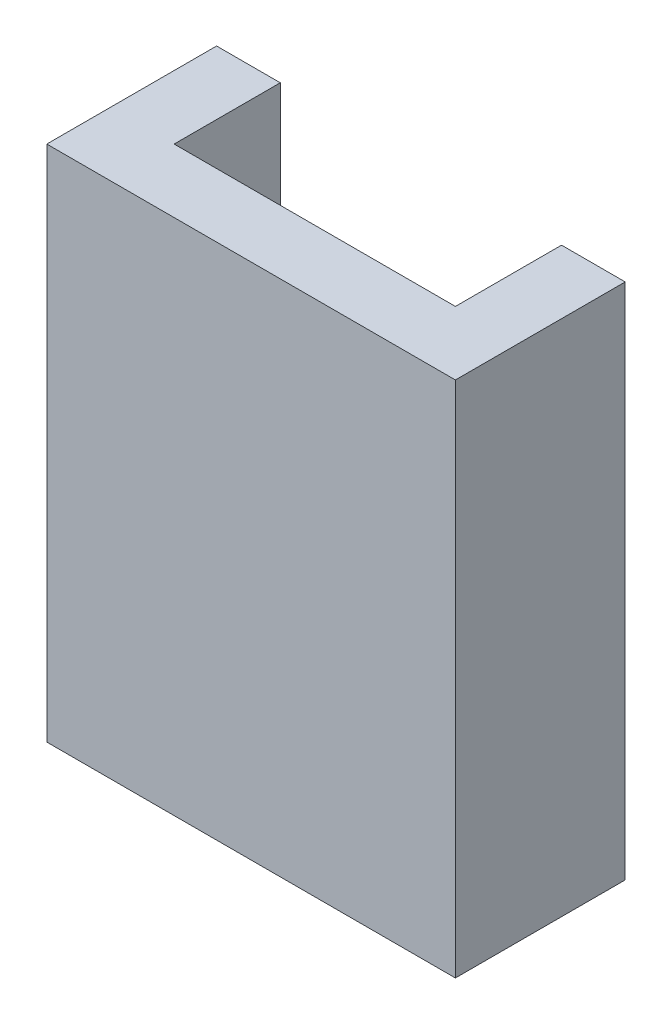
ISO-10303-21;
HEADER;
FILE_DESCRIPTION(('STEP AP214'),'2;1');
FILE_NAME('part.step','',(''),(''),'','','');
FILE_SCHEMA(('AUTOMOTIVE_DESIGN { 1 0 10303 214 1 1 1 1 }'));
ENDSEC;
DATA;
#1=APPLICATION_CONTEXT('core data for automotive mechanical design processes');
#2=APPLICATION_PROTOCOL_DEFINITION('international standard','automotive_design',2000,#1);
#3=PRODUCT_CONTEXT('',#1,'mechanical');
#4=PRODUCT('Part','Part','',(#3));
#5=PRODUCT_RELATED_PRODUCT_CATEGORY('part','',(#4));
#6=PRODUCT_DEFINITION_FORMATION('','',#4);
#7=PRODUCT_DEFINITION_CONTEXT('part definition',#1,'design');
#8=PRODUCT_DEFINITION('design','',#6,#7);
#9=PRODUCT_DEFINITION_SHAPE('','',#8);
#10=(LENGTH_UNIT() NAMED_UNIT(*) SI_UNIT(.MILLI.,.METRE.));
#11=(NAMED_UNIT(*) PLANE_ANGLE_UNIT() SI_UNIT($,.RADIAN.));
#12=(NAMED_UNIT(*) SI_UNIT($,.STERADIAN.) SOLID_ANGLE_UNIT());
#13=UNCERTAINTY_MEASURE_WITH_UNIT(LENGTH_MEASURE(1.E-05),#10,'distance_accuracy_value','');
#14=(GEOMETRIC_REPRESENTATION_CONTEXT(3) GLOBAL_UNCERTAINTY_ASSIGNED_CONTEXT((#13)) GLOBAL_UNIT_ASSIGNED_CONTEXT((#10,
#11,#12)) REPRESENTATION_CONTEXT('',''));
#15=CARTESIAN_POINT('',(0.,0.,0.));
#16=DIRECTION('',(0.,0.,1.));
#17=DIRECTION('',(1.,0.,0.));
#18=AXIS2_PLACEMENT_3D('',#15,#16,#17);
#19=CARTESIAN_POINT('',(0.,24.4,0.));
#20=DIRECTION('',(0.,0.,-1.));
#21=DIRECTION('',(-1.,0.,0.));
#22=AXIS2_PLACEMENT_3D('',#19,#20,#21);
#23=PLANE('',#22);
#24=DIRECTION('',(1.,0.,0.));
#25=VECTOR('',#24,1.);
#26=CARTESIAN_POINT('',(0.,0.,0.));
#27=LINE('',#26,#25);
#28=CARTESIAN_POINT('',(-9.625,0.,0.));
#29=VERTEX_POINT('',#28);
#30=CARTESIAN_POINT('',(-6.625,0.,0.));
#31=VERTEX_POINT('',#30);
#32=EDGE_CURVE('E139',#29,#31,#27,.T.);
#33=ORIENTED_EDGE('',*,*,#32,.F.);
#34=DIRECTION('',(0.,-1.,0.));
#35=VECTOR('',#34,1.);
#36=CARTESIAN_POINT('',(-9.625,24.4,0.));
#37=LINE('',#36,#35);
#38=CARTESIAN_POINT('',(-9.625,24.4,0.));
#39=VERTEX_POINT('',#38);
#40=EDGE_CURVE('E11',#39,#29,#37,.T.);
#41=ORIENTED_EDGE('',*,*,#40,.F.);
#42=DIRECTION('',(1.,0.,0.));
#43=VECTOR('',#42,1.);
#44=CARTESIAN_POINT('',(0.,24.4,0.));
#45=LINE('',#44,#43);
#46=CARTESIAN_POINT('',(-6.625,24.4,0.));
#47=VERTEX_POINT('',#46);
#48=EDGE_CURVE('E163',#39,#47,#45,.T.);
#49=ORIENTED_EDGE('',*,*,#48,.T.);
#50=DIRECTION('',(0.,-1.,0.));
#51=VECTOR('',#50,1.);
#52=CARTESIAN_POINT('',(-6.625,24.4,0.));
#53=LINE('',#52,#51);
#54=EDGE_CURVE('E93',#47,#31,#53,.T.);
#55=ORIENTED_EDGE('',*,*,#54,.T.);
#56=EDGE_LOOP('',(#33,#41,#49,#55));
#57=FACE_BOUND('',#56,.T.);
#58=ADVANCED_FACE('F41',(#57),#23,.T.);
#59=CARTESIAN_POINT('',(-9.625,24.4,0.));
#60=DIRECTION('',(-1.,0.,0.));
#61=DIRECTION('',(0.,0.,1.));
#62=AXIS2_PLACEMENT_3D('',#59,#60,#61);
#63=PLANE('',#62);
#64=DIRECTION('',(0.,0.,-1.));
#65=VECTOR('',#64,1.);
#66=CARTESIAN_POINT('',(-9.625,0.,0.));
#67=LINE('',#66,#65);
#68=CARTESIAN_POINT('',(-9.625,0.,8.));
#69=VERTEX_POINT('',#68);
#70=EDGE_CURVE('E143',#69,#29,#67,.T.);
#71=ORIENTED_EDGE('',*,*,#70,.F.);
#72=DIRECTION('',(0.,-1.,0.));
#73=VECTOR('',#72,1.);
#74=CARTESIAN_POINT('',(-9.625,24.4,8.));
#75=LINE('',#74,#73);
#76=CARTESIAN_POINT('',(-9.625,24.4,8.));
#77=VERTEX_POINT('',#76);
#78=EDGE_CURVE('E51',#77,#69,#75,.T.);
#79=ORIENTED_EDGE('',*,*,#78,.F.);
#80=DIRECTION('',(0.,0.,-1.));
#81=VECTOR('',#80,1.);
#82=CARTESIAN_POINT('',(-9.625,24.4,0.));
#83=LINE('',#82,#81);
#84=EDGE_CURVE('E191',#77,#39,#83,.T.);
#85=ORIENTED_EDGE('',*,*,#84,.T.);
#86=ORIENTED_EDGE('',*,*,#40,.T.);
#87=EDGE_LOOP('',(#71,#79,#85,#86));
#88=FACE_BOUND('',#87,.T.);
#89=ADVANCED_FACE('F43',(#88),#63,.T.);
#90=CARTESIAN_POINT('',(0.,24.4,8.));
#91=DIRECTION('',(0.,0.,-1.));
#92=DIRECTION('',(-1.,0.,0.));
#93=AXIS2_PLACEMENT_3D('',#90,#91,#92);
#94=PLANE('',#93);
#95=DIRECTION('',(1.,0.,0.));
#96=VECTOR('',#95,1.);
#97=CARTESIAN_POINT('',(0.,0.,8.));
#98=LINE('',#97,#96);
#99=CARTESIAN_POINT('',(9.625,0.,8.));
#100=VERTEX_POINT('',#99);
#101=EDGE_CURVE('E148',#69,#100,#98,.T.);
#102=ORIENTED_EDGE('',*,*,#101,.T.);
#103=DIRECTION('',(0.,-1.,0.));
#104=VECTOR('',#103,1.);
#105=CARTESIAN_POINT('',(9.625,24.4,8.));
#106=LINE('',#105,#104);
#107=CARTESIAN_POINT('',(9.625,24.4,8.));
#108=VERTEX_POINT('',#107);
#109=EDGE_CURVE('E173',#108,#100,#106,.T.);
#110=ORIENTED_EDGE('',*,*,#109,.F.);
#111=DIRECTION('',(1.,0.,0.));
#112=VECTOR('',#111,1.);
#113=CARTESIAN_POINT('',(0.,24.4,8.));
#114=LINE('',#113,#112);
#115=EDGE_CURVE('E182',#77,#108,#114,.T.);
#116=ORIENTED_EDGE('',*,*,#115,.F.);
#117=ORIENTED_EDGE('',*,*,#78,.T.);
#118=EDGE_LOOP('',(#102,#110,#116,#117));
#119=FACE_BOUND('',#118,.T.);
#120=ADVANCED_FACE('F180',(#119),#94,.F.);
#121=CARTESIAN_POINT('',(9.625,24.4,0.));
#122=DIRECTION('',(-1.,0.,0.));
#123=DIRECTION('',(0.,0.,1.));
#124=AXIS2_PLACEMENT_3D('',#121,#122,#123);
#125=PLANE('',#124);
#126=DIRECTION('',(0.,0.,-1.));
#127=VECTOR('',#126,1.);
#128=CARTESIAN_POINT('',(9.625,0.,0.));
#129=LINE('',#128,#127);
#130=CARTESIAN_POINT('',(9.625,0.,0.));
#131=VERTEX_POINT('',#130);
#132=EDGE_CURVE('E151',#100,#131,#129,.T.);
#133=ORIENTED_EDGE('',*,*,#132,.T.);
#134=DIRECTION('',(0.,-1.,0.));
#135=VECTOR('',#134,1.);
#136=CARTESIAN_POINT('',(9.625,24.4,0.));
#137=LINE('',#136,#135);
#138=CARTESIAN_POINT('',(9.625,24.4,0.));
#139=VERTEX_POINT('',#138);
#140=EDGE_CURVE('E170',#139,#131,#137,.T.);
#141=ORIENTED_EDGE('',*,*,#140,.F.);
#142=DIRECTION('',(0.,0.,-1.));
#143=VECTOR('',#142,1.);
#144=CARTESIAN_POINT('',(9.625,24.4,0.));
#145=LINE('',#144,#143);
#146=EDGE_CURVE('E198',#108,#139,#145,.T.);
#147=ORIENTED_EDGE('',*,*,#146,.F.);
#148=ORIENTED_EDGE('',*,*,#109,.T.);
#149=EDGE_LOOP('',(#133,#141,#147,#148));
#150=FACE_BOUND('',#149,.T.);
#151=ADVANCED_FACE('F206',(#150),#125,.F.);
#152=CARTESIAN_POINT('',(6.625,0.,0.));
#153=VERTEX_POINT('',#152);
#154=EDGE_CURVE('E144',#153,#131,#27,.T.);
#155=ORIENTED_EDGE('',*,*,#154,.F.);
#156=DIRECTION('',(0.,-1.,0.));
#157=VECTOR('',#156,1.);
#158=CARTESIAN_POINT('',(6.625,24.4,0.));
#159=LINE('',#158,#157);
#160=CARTESIAN_POINT('',(6.625,24.4,0.));
#161=VERTEX_POINT('',#160);
#162=EDGE_CURVE('E123',#161,#153,#159,.T.);
#163=ORIENTED_EDGE('',*,*,#162,.F.);
#164=EDGE_CURVE('E129',#161,#139,#45,.T.);
#165=ORIENTED_EDGE('',*,*,#164,.T.);
#166=ORIENTED_EDGE('',*,*,#140,.T.);
#167=EDGE_LOOP('',(#155,#163,#165,#166));
#168=FACE_BOUND('',#167,.T.);
#169=ADVANCED_FACE('F208',(#168),#23,.T.);
#170=CARTESIAN_POINT('',(6.625,24.4,0.));
#171=DIRECTION('',(-1.,0.,0.));
#172=DIRECTION('',(0.,0.,1.));
#173=AXIS2_PLACEMENT_3D('',#170,#171,#172);
#174=PLANE('',#173);
#175=DIRECTION('',(0.,0.,-1.));
#176=VECTOR('',#175,1.);
#177=CARTESIAN_POINT('',(6.625,0.,0.));
#178=LINE('',#177,#176);
#179=CARTESIAN_POINT('',(6.625,0.,5.));
#180=VERTEX_POINT('',#179);
#181=EDGE_CURVE('E117',#180,#153,#178,.T.);
#182=ORIENTED_EDGE('',*,*,#181,.F.);
#183=DIRECTION('',(0.,-1.,0.));
#184=VECTOR('',#183,1.);
#185=CARTESIAN_POINT('',(6.625,24.4,5.));
#186=LINE('',#185,#184);
#187=CARTESIAN_POINT('',(6.625,24.4,5.));
#188=VERTEX_POINT('',#187);
#189=EDGE_CURVE('E112',#188,#180,#186,.T.);
#190=ORIENTED_EDGE('',*,*,#189,.F.);
#191=DIRECTION('',(0.,0.,-1.));
#192=VECTOR('',#191,1.);
#193=CARTESIAN_POINT('',(6.625,24.4,0.));
#194=LINE('',#193,#192);
#195=EDGE_CURVE('E115',#188,#161,#194,.T.);
#196=ORIENTED_EDGE('',*,*,#195,.T.);
#197=ORIENTED_EDGE('',*,*,#162,.T.);
#198=EDGE_LOOP('',(#182,#190,#196,#197));
#199=FACE_BOUND('',#198,.T.);
#200=ADVANCED_FACE('F114',(#199),#174,.T.);
#201=CARTESIAN_POINT('',(0.,24.4,5.));
#202=DIRECTION('',(0.,0.,-1.));
#203=DIRECTION('',(-1.,0.,0.));
#204=AXIS2_PLACEMENT_3D('',#201,#202,#203);
#205=PLANE('',#204);
#206=DIRECTION('',(1.,0.,0.));
#207=VECTOR('',#206,1.);
#208=CARTESIAN_POINT('',(0.,0.,5.));
#209=LINE('',#208,#207);
#210=CARTESIAN_POINT('',(-6.625,0.,5.));
#211=VERTEX_POINT('',#210);
#212=EDGE_CURVE('E157',#211,#180,#209,.T.);
#213=ORIENTED_EDGE('',*,*,#212,.F.);
#214=DIRECTION('',(0.,-1.,0.));
#215=VECTOR('',#214,1.);
#216=CARTESIAN_POINT('',(-6.625,24.4,5.));
#217=LINE('',#216,#215);
#218=CARTESIAN_POINT('',(-6.625,24.4,5.));
#219=VERTEX_POINT('',#218);
#220=EDGE_CURVE('E86',#219,#211,#217,.T.);
#221=ORIENTED_EDGE('',*,*,#220,.F.);
#222=DIRECTION('',(1.,0.,0.));
#223=VECTOR('',#222,1.);
#224=CARTESIAN_POINT('',(0.,24.4,5.));
#225=LINE('',#224,#223);
#226=EDGE_CURVE('E127',#219,#188,#225,.T.);
#227=ORIENTED_EDGE('',*,*,#226,.T.);
#228=ORIENTED_EDGE('',*,*,#189,.T.);
#229=EDGE_LOOP('',(#213,#221,#227,#228));
#230=FACE_BOUND('',#229,.T.);
#231=ADVANCED_FACE('F132',(#230),#205,.T.);
#232=CARTESIAN_POINT('',(-6.625,24.4,0.));
#233=DIRECTION('',(-1.,0.,0.));
#234=DIRECTION('',(0.,0.,1.));
#235=AXIS2_PLACEMENT_3D('',#232,#233,#234);
#236=PLANE('',#235);
#237=DIRECTION('',(0.,0.,-1.));
#238=VECTOR('',#237,1.);
#239=CARTESIAN_POINT('',(-6.625,0.,0.));
#240=LINE('',#239,#238);
#241=EDGE_CURVE('E160',#211,#31,#240,.T.);
#242=ORIENTED_EDGE('',*,*,#241,.T.);
#243=ORIENTED_EDGE('',*,*,#54,.F.);
#244=DIRECTION('',(0.,0.,-1.));
#245=VECTOR('',#244,1.);
#246=CARTESIAN_POINT('',(-6.625,24.4,0.));
#247=LINE('',#246,#245);
#248=EDGE_CURVE('E59',#219,#47,#247,.T.);
#249=ORIENTED_EDGE('',*,*,#248,.F.);
#250=ORIENTED_EDGE('',*,*,#220,.T.);
#251=EDGE_LOOP('',(#242,#243,#249,#250));
#252=FACE_BOUND('',#251,.T.);
#253=ADVANCED_FACE('F192',(#252),#236,.F.);
#254=CARTESIAN_POINT('',(0.,24.4,0.));
#255=DIRECTION('',(0.,1.,0.));
#256=DIRECTION('',(0.,0.,1.));
#257=AXIS2_PLACEMENT_3D('',#254,#255,#256);
#258=PLANE('',#257);
#259=ORIENTED_EDGE('',*,*,#48,.F.);
#260=ORIENTED_EDGE('',*,*,#84,.F.);
#261=ORIENTED_EDGE('',*,*,#115,.T.);
#262=ORIENTED_EDGE('',*,*,#146,.T.);
#263=ORIENTED_EDGE('',*,*,#164,.F.);
#264=ORIENTED_EDGE('',*,*,#195,.F.);
#265=ORIENTED_EDGE('',*,*,#226,.F.);
#266=ORIENTED_EDGE('',*,*,#248,.T.);
#267=EDGE_LOOP('',(#259,#260,#261,#262,#263,#264,#265,#266));
#268=FACE_BOUND('',#267,.T.);
#269=ADVANCED_FACE('F126',(#268),#258,.T.);
#270=CARTESIAN_POINT('',(0.,0.,0.));
#271=DIRECTION('',(0.,1.,0.));
#272=DIRECTION('',(0.,0.,1.));
#273=AXIS2_PLACEMENT_3D('',#270,#271,#272);
#274=PLANE('',#273);
#275=ORIENTED_EDGE('',*,*,#32,.T.);
#276=ORIENTED_EDGE('',*,*,#241,.F.);
#277=ORIENTED_EDGE('',*,*,#212,.T.);
#278=ORIENTED_EDGE('',*,*,#181,.T.);
#279=ORIENTED_EDGE('',*,*,#154,.T.);
#280=ORIENTED_EDGE('',*,*,#132,.F.);
#281=ORIENTED_EDGE('',*,*,#101,.F.);
#282=ORIENTED_EDGE('',*,*,#70,.T.);
#283=EDGE_LOOP('',(#275,#276,#277,#278,#279,#280,#281,#282));
#284=FACE_BOUND('',#283,.T.);
#285=ADVANCED_FACE('F189',(#284),#274,.F.);
#286=CLOSED_SHELL('',(#58,#89,#120,#151,#169,#200,#231,#253,#269,#285));
#287=MANIFOLD_SOLID_BREP('B2',#286);
#288=ADVANCED_BREP_SHAPE_REPRESENTATION('',(#18,#287),#14);
#289=SHAPE_DEFINITION_REPRESENTATION(#9,#288);
ENDSEC;
END-ISO-10303-21;
